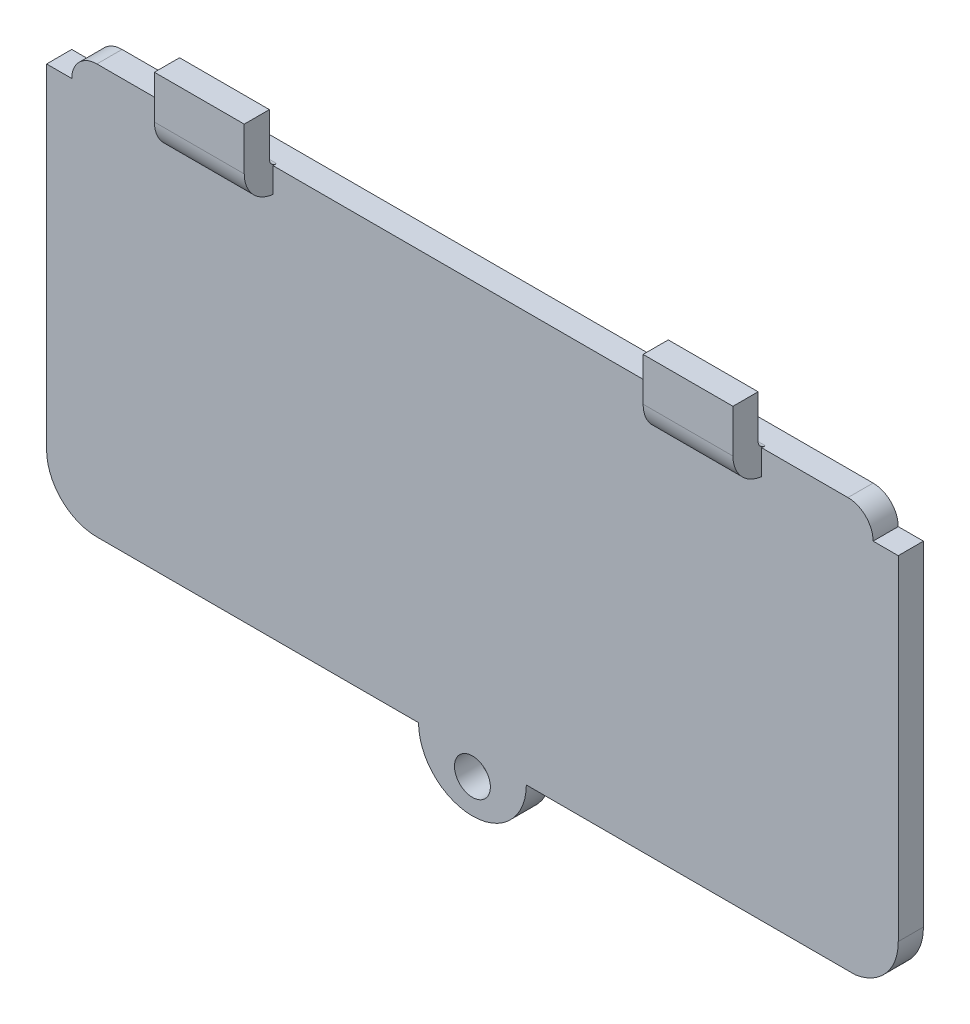
ISO-10303-21;
HEADER;
FILE_DESCRIPTION(('STEP AP214'),'2;1');
FILE_NAME('part.step','',(''),(''),'','','');
FILE_SCHEMA(('AUTOMOTIVE_DESIGN { 1 0 10303 214 1 1 1 1 }'));
ENDSEC;
DATA;
#1=APPLICATION_CONTEXT('core data for automotive mechanical design processes');
#2=APPLICATION_PROTOCOL_DEFINITION('international standard','automotive_design',2000,#1);
#3=PRODUCT_CONTEXT('',#1,'mechanical');
#4=PRODUCT('Part','Part','',(#3));
#5=PRODUCT_RELATED_PRODUCT_CATEGORY('part','',(#4));
#6=PRODUCT_DEFINITION_FORMATION('','',#4);
#7=PRODUCT_DEFINITION_CONTEXT('part definition',#1,'design');
#8=PRODUCT_DEFINITION('design','',#6,#7);
#9=PRODUCT_DEFINITION_SHAPE('','',#8);
#10=(LENGTH_UNIT() NAMED_UNIT(*) SI_UNIT(.MILLI.,.METRE.));
#11=(NAMED_UNIT(*) PLANE_ANGLE_UNIT() SI_UNIT($,.RADIAN.));
#12=(NAMED_UNIT(*) SI_UNIT($,.STERADIAN.) SOLID_ANGLE_UNIT());
#13=UNCERTAINTY_MEASURE_WITH_UNIT(LENGTH_MEASURE(1.E-05),#10,'distance_accuracy_value','');
#14=(GEOMETRIC_REPRESENTATION_CONTEXT(3) GLOBAL_UNCERTAINTY_ASSIGNED_CONTEXT((#13)) GLOBAL_UNIT_ASSIGNED_CONTEXT((#10,
#11,#12)) REPRESENTATION_CONTEXT('',''));
#15=CARTESIAN_POINT('',(0.,0.,0.));
#16=DIRECTION('',(0.,0.,1.));
#17=DIRECTION('',(1.,0.,0.));
#18=AXIS2_PLACEMENT_3D('',#15,#16,#17);
#19=CARTESIAN_POINT('',(20.193,14.351,1.524));
#20=DIRECTION('',(-1.,0.,0.));
#21=DIRECTION('',(0.,0.,1.));
#22=AXIS2_PLACEMENT_3D('',#19,#20,#21);
#23=CYLINDRICAL_SURFACE('',#22,2.286);
#24=DIRECTION('',(-1.,0.,0.));
#25=VECTOR('',#24,1.);
#26=CARTESIAN_POINT('',(20.193,12.0791549348602,1.778));
#27=LINE('',#26,#25);
#28=CARTESIAN_POINT('',(-14.351,12.0791549348602,1.778));
#29=VERTEX_POINT('',#28);
#30=CARTESIAN_POINT('',(-20.701,12.0791549348602,1.778));
#31=VERTEX_POINT('',#30);
#32=EDGE_CURVE('E391',#29,#31,#27,.T.);
#33=ORIENTED_EDGE('',*,*,#32,.F.);
#34=CARTESIAN_POINT('',(-14.351,14.351,1.524));
#35=DIRECTION('',(-1.,0.,0.));
#36=DIRECTION('',(0.,0.,1.));
#37=AXIS2_PLACEMENT_3D('',#34,#35,#36);
#38=CIRCLE('',#37,2.286);
#39=CARTESIAN_POINT('',(-14.351,14.351,3.81));
#40=VERTEX_POINT('',#39);
#41=EDGE_CURVE('E48',#40,#29,#38,.F.);
#42=ORIENTED_EDGE('',*,*,#41,.F.);
#43=DIRECTION('',(-1.,0.,0.));
#44=VECTOR('',#43,1.);
#45=CARTESIAN_POINT('',(20.193,14.351,3.81));
#46=LINE('',#45,#44);
#47=CARTESIAN_POINT('',(-20.701,14.351,3.81));
#48=VERTEX_POINT('',#47);
#49=EDGE_CURVE('E287',#40,#48,#46,.T.);
#50=ORIENTED_EDGE('',*,*,#49,.T.);
#51=CARTESIAN_POINT('',(-20.701,14.351,1.524));
#52=DIRECTION('',(-1.,0.,0.));
#53=DIRECTION('',(0.,0.,1.));
#54=AXIS2_PLACEMENT_3D('',#51,#52,#53);
#55=CIRCLE('',#54,2.286);
#56=EDGE_CURVE('E260',#31,#48,#55,.T.);
#57=ORIENTED_EDGE('',*,*,#56,.F.);
#58=EDGE_LOOP('',(#33,#42,#50,#57));
#59=FACE_BOUND('',#58,.T.);
#60=ADVANCED_FACE('F34',(#59),#23,.T.);
#61=CARTESIAN_POINT('',(20.193,14.351,1.524));
#62=DIRECTION('',(-1.,0.,0.));
#63=DIRECTION('',(0.,0.,1.));
#64=AXIS2_PLACEMENT_3D('',#61,#62,#63);
#65=CYLINDRICAL_SURFACE('',#64,0.508);
#66=CARTESIAN_POINT('',(-14.351,14.351,1.524));
#67=DIRECTION('',(-1.,0.,0.));
#68=DIRECTION('',(0.,0.,1.));
#69=AXIS2_PLACEMENT_3D('',#66,#67,#68);
#70=CIRCLE('',#69,0.508);
#71=CARTESIAN_POINT('',(-14.351,13.843,1.524));
#72=VERTEX_POINT('',#71);
#73=CARTESIAN_POINT('',(-14.351,14.351,2.032));
#74=VERTEX_POINT('',#73);
#75=EDGE_CURVE('E240',#72,#74,#70,.T.);
#76=ORIENTED_EDGE('',*,*,#75,.F.);
#77=DIRECTION('',(-1.,0.,0.));
#78=VECTOR('',#77,1.);
#79=CARTESIAN_POINT('',(20.193,13.843,1.524));
#80=LINE('',#79,#78);
#81=CARTESIAN_POINT('',(-20.701,13.843,1.524));
#82=VERTEX_POINT('',#81);
#83=EDGE_CURVE('E224',#72,#82,#80,.T.);
#84=ORIENTED_EDGE('',*,*,#83,.T.);
#85=CARTESIAN_POINT('',(-20.701,14.351,1.524));
#86=DIRECTION('',(1.,0.,0.));
#87=DIRECTION('',(0.,0.,1.));
#88=AXIS2_PLACEMENT_3D('',#85,#86,#87);
#89=CIRCLE('',#88,0.508);
#90=CARTESIAN_POINT('',(-20.701,14.351,2.032));
#91=VERTEX_POINT('',#90);
#92=EDGE_CURVE('E242',#91,#82,#89,.T.);
#93=ORIENTED_EDGE('',*,*,#92,.F.);
#94=DIRECTION('',(-1.,0.,0.));
#95=VECTOR('',#94,1.);
#96=CARTESIAN_POINT('',(20.193,14.351,2.032));
#97=LINE('',#96,#95);
#98=EDGE_CURVE('E275',#74,#91,#97,.T.);
#99=ORIENTED_EDGE('',*,*,#98,.F.);
#100=EDGE_LOOP('',(#76,#84,#93,#99));
#101=FACE_BOUND('',#100,.T.);
#102=ADVANCED_FACE('F436',(#101),#65,.F.);
#103=CARTESIAN_POINT('',(20.193,14.351,2.032));
#104=DIRECTION('',(0.,0.,-1.));
#105=DIRECTION('',(-1.,0.,0.));
#106=AXIS2_PLACEMENT_3D('',#103,#104,#105);
#107=PLANE('',#106);
#108=DIRECTION('',(0.,1.,0.));
#109=VECTOR('',#108,1.);
#110=CARTESIAN_POINT('',(-14.351,14.351,2.032));
#111=LINE('',#110,#109);
#112=CARTESIAN_POINT('',(-14.351,17.399,2.032));
#113=VERTEX_POINT('',#112);
#114=EDGE_CURVE('E238',#74,#113,#111,.T.);
#115=ORIENTED_EDGE('',*,*,#114,.F.);
#116=ORIENTED_EDGE('',*,*,#98,.T.);
#117=DIRECTION('',(0.,-1.,0.));
#118=VECTOR('',#117,1.);
#119=CARTESIAN_POINT('',(-20.701,14.351,2.032));
#120=LINE('',#119,#118);
#121=CARTESIAN_POINT('',(-20.701,17.399,2.032));
#122=VERTEX_POINT('',#121);
#123=EDGE_CURVE('E247',#122,#91,#120,.T.);
#124=ORIENTED_EDGE('',*,*,#123,.F.);
#125=DIRECTION('',(-1.,0.,0.));
#126=VECTOR('',#125,1.);
#127=CARTESIAN_POINT('',(20.193,17.399,2.032));
#128=LINE('',#127,#126);
#129=EDGE_CURVE('E279',#113,#122,#128,.T.);
#130=ORIENTED_EDGE('',*,*,#129,.F.);
#131=EDGE_LOOP('',(#115,#116,#124,#130));
#132=FACE_BOUND('',#131,.T.);
#133=ADVANCED_FACE('F441',(#132),#107,.T.);
#134=CARTESIAN_POINT('',(20.193,17.399,2.032));
#135=DIRECTION('',(0.,1.,0.));
#136=DIRECTION('',(0.,0.,1.));
#137=AXIS2_PLACEMENT_3D('',#134,#135,#136);
#138=PLANE('',#137);
#139=DIRECTION('',(0.,0.,1.));
#140=VECTOR('',#139,1.);
#141=CARTESIAN_POINT('',(-14.351,17.399,-1.397));
#142=LINE('',#141,#140);
#143=CARTESIAN_POINT('',(-14.351,17.399,3.81));
#144=VERTEX_POINT('',#143);
#145=EDGE_CURVE('E233',#113,#144,#142,.T.);
#146=ORIENTED_EDGE('',*,*,#145,.F.);
#147=ORIENTED_EDGE('',*,*,#129,.T.);
#148=DIRECTION('',(0.,0.,-1.));
#149=VECTOR('',#148,1.);
#150=CARTESIAN_POINT('',(-20.701,17.399,2.032));
#151=LINE('',#150,#149);
#152=CARTESIAN_POINT('',(-20.701,17.399,3.81));
#153=VERTEX_POINT('',#152);
#154=EDGE_CURVE('E266',#153,#122,#151,.T.);
#155=ORIENTED_EDGE('',*,*,#154,.F.);
#156=DIRECTION('',(-1.,0.,0.));
#157=VECTOR('',#156,1.);
#158=CARTESIAN_POINT('',(20.193,17.399,3.81));
#159=LINE('',#158,#157);
#160=EDGE_CURVE('E283',#144,#153,#159,.T.);
#161=ORIENTED_EDGE('',*,*,#160,.F.);
#162=EDGE_LOOP('',(#146,#147,#155,#161));
#163=FACE_BOUND('',#162,.T.);
#164=ADVANCED_FACE('F540',(#163),#138,.T.);
#165=CARTESIAN_POINT('',(20.193,14.351,3.81));
#166=DIRECTION('',(0.,0.,1.));
#167=DIRECTION('',(1.,0.,0.));
#168=AXIS2_PLACEMENT_3D('',#165,#166,#167);
#169=PLANE('',#168);
#170=DIRECTION('',(0.,-1.,0.));
#171=VECTOR('',#170,1.);
#172=CARTESIAN_POINT('',(-14.351,14.351,3.81));
#173=LINE('',#172,#171);
#174=EDGE_CURVE('E11',#144,#40,#173,.T.);
#175=ORIENTED_EDGE('',*,*,#174,.F.);
#176=ORIENTED_EDGE('',*,*,#160,.T.);
#177=DIRECTION('',(0.,1.,0.));
#178=VECTOR('',#177,1.);
#179=CARTESIAN_POINT('',(-20.701,14.351,3.81));
#180=LINE('',#179,#178);
#181=EDGE_CURVE('E263',#48,#153,#180,.T.);
#182=ORIENTED_EDGE('',*,*,#181,.F.);
#183=ORIENTED_EDGE('',*,*,#49,.F.);
#184=EDGE_LOOP('',(#175,#176,#182,#183));
#185=FACE_BOUND('',#184,.T.);
#186=ADVANCED_FACE('F534',(#185),#169,.T.);
#187=CARTESIAN_POINT('',(-26.797,13.843,1.778));
#188=DIRECTION('',(0.,-1.,0.));
#189=DIRECTION('',(0.,0.,-1.));
#190=AXIS2_PLACEMENT_3D('',#187,#188,#189);
#191=PLANE('',#190);
#192=DIRECTION('',(0.,0.,1.));
#193=VECTOR('',#192,1.);
#194=CARTESIAN_POINT('',(-14.351,13.843,-1.397));
#195=LINE('',#194,#193);
#196=CARTESIAN_POINT('',(-14.351,13.843,1.778));
#197=VERTEX_POINT('',#196);
#198=EDGE_CURVE('E216',#72,#197,#195,.T.);
#199=ORIENTED_EDGE('',*,*,#198,.T.);
#200=DIRECTION('',(1.,0.,0.));
#201=VECTOR('',#200,1.);
#202=CARTESIAN_POINT('',(-26.797,13.843,1.778));
#203=LINE('',#202,#201);
#204=CARTESIAN_POINT('',(13.843,13.843,1.778));
#205=VERTEX_POINT('',#204);
#206=EDGE_CURVE('E206',#197,#205,#203,.T.);
#207=ORIENTED_EDGE('',*,*,#206,.T.);
#208=DIRECTION('',(0.,0.,1.));
#209=VECTOR('',#208,1.);
#210=CARTESIAN_POINT('',(13.843,13.843,-1.397));
#211=LINE('',#210,#209);
#212=CARTESIAN_POINT('',(13.843,13.843,1.524));
#213=VERTEX_POINT('',#212);
#214=EDGE_CURVE('E225',#213,#205,#211,.T.);
#215=ORIENTED_EDGE('',*,*,#214,.F.);
#216=CARTESIAN_POINT('',(20.193,13.843,1.524));
#217=VERTEX_POINT('',#216);
#218=EDGE_CURVE('E288',#217,#213,#80,.T.);
#219=ORIENTED_EDGE('',*,*,#218,.F.);
#220=DIRECTION('',(0.,0.,-1.));
#221=VECTOR('',#220,1.);
#222=CARTESIAN_POINT('',(20.193,13.843,1.778));
#223=LINE('',#222,#221);
#224=CARTESIAN_POINT('',(20.193,13.843,1.778));
#225=VERTEX_POINT('',#224);
#226=EDGE_CURVE('E292',#225,#217,#223,.T.);
#227=ORIENTED_EDGE('',*,*,#226,.F.);
#228=DIRECTION('',(-1.,0.,0.));
#229=VECTOR('',#228,1.);
#230=CARTESIAN_POINT('',(-26.797,13.843,1.778));
#231=LINE('',#230,#229);
#232=CARTESIAN_POINT('',(26.289,13.843,1.778));
#233=VERTEX_POINT('',#232);
#234=EDGE_CURVE('E306',#233,#225,#231,.T.);
#235=ORIENTED_EDGE('',*,*,#234,.F.);
#236=DIRECTION('',(0.,0.,-1.));
#237=VECTOR('',#236,1.);
#238=CARTESIAN_POINT('',(26.289,13.843,1.778));
#239=LINE('',#238,#237);
#240=CARTESIAN_POINT('',(26.289,13.843,0.));
#241=VERTEX_POINT('',#240);
#242=EDGE_CURVE('E385',#233,#241,#239,.T.);
#243=ORIENTED_EDGE('',*,*,#242,.T.);
#244=DIRECTION('',(-1.,0.,0.));
#245=VECTOR('',#244,1.);
#246=CARTESIAN_POINT('',(-26.797,13.843,0.));
#247=LINE('',#246,#245);
#248=CARTESIAN_POINT('',(-26.797,13.843,0.));
#249=VERTEX_POINT('',#248);
#250=EDGE_CURVE('E332',#241,#249,#247,.T.);
#251=ORIENTED_EDGE('',*,*,#250,.T.);
#252=DIRECTION('',(0.,0.,-1.));
#253=VECTOR('',#252,1.);
#254=CARTESIAN_POINT('',(-26.797,13.843,1.778));
#255=LINE('',#254,#253);
#256=CARTESIAN_POINT('',(-26.797,13.843,1.778));
#257=VERTEX_POINT('',#256);
#258=EDGE_CURVE('E382',#257,#249,#255,.T.);
#259=ORIENTED_EDGE('',*,*,#258,.F.);
#260=CARTESIAN_POINT('',(-20.701,13.843,1.778));
#261=VERTEX_POINT('',#260);
#262=EDGE_CURVE('E304',#261,#257,#231,.T.);
#263=ORIENTED_EDGE('',*,*,#262,.F.);
#264=DIRECTION('',(0.,0.,-1.));
#265=VECTOR('',#264,1.);
#266=CARTESIAN_POINT('',(-20.701,13.843,1.778));
#267=LINE('',#266,#265);
#268=EDGE_CURVE('E274',#261,#82,#267,.T.);
#269=ORIENTED_EDGE('',*,*,#268,.T.);
#270=ORIENTED_EDGE('',*,*,#83,.F.);
#271=EDGE_LOOP('',(#199,#207,#215,#219,#227,#235,#243,#251,#259,#263,#269,#270));
#272=FACE_BOUND('',#271,.T.);
#273=ADVANCED_FACE('F222',(#272),#191,.F.);
#274=CARTESIAN_POINT('',(26.289,12.065,1.778));
#275=DIRECTION('',(0.,0.,-1.));
#276=DIRECTION('',(-1.,0.,0.));
#277=AXIS2_PLACEMENT_3D('',#274,#275,#276);
#278=PLANE('',#277);
#279=CARTESIAN_POINT('',(-0.253999999999994,-16.51,1.778));
#280=DIRECTION('',(0.,0.,-1.));
#281=DIRECTION('',(-1.,0.,0.));
#282=AXIS2_PLACEMENT_3D('',#279,#280,#281);
#283=CIRCLE('',#282,1.27);
#284=CARTESIAN_POINT('',(-1.524,-16.51,1.778));
#285=VERTEX_POINT('',#284);
#286=EDGE_CURVE('E295',#285,#285,#283,.T.);
#287=ORIENTED_EDGE('',*,*,#286,.T.);
#288=EDGE_LOOP('',(#287));
#289=FACE_BOUND('',#288,.T.);
#290=CARTESIAN_POINT('',(-0.254000000000006,-15.113,1.778));
#291=DIRECTION('',(0.,0.,1.));
#292=DIRECTION('',(1.,0.,0.));
#293=AXIS2_PLACEMENT_3D('',#290,#291,#292);
#294=CIRCLE('',#293,3.81);
#295=CARTESIAN_POINT('',(-4.06400000000001,-15.113,1.778));
#296=VERTEX_POINT('',#295);
#297=CARTESIAN_POINT('',(3.55599999999999,-15.113,1.778));
#298=VERTEX_POINT('',#297);
#299=EDGE_CURVE('E319',#296,#298,#294,.T.);
#300=ORIENTED_EDGE('',*,*,#299,.T.);
#301=DIRECTION('',(1.,0.,0.));
#302=VECTOR('',#301,1.);
#303=CARTESIAN_POINT('',(3.55599999999999,-15.113,1.778));
#304=LINE('',#303,#302);
#305=CARTESIAN_POINT('',(26.797,-15.113,1.778));
#306=VERTEX_POINT('',#305);
#307=EDGE_CURVE('E321',#298,#306,#304,.T.);
#308=ORIENTED_EDGE('',*,*,#307,.T.);
#309=CARTESIAN_POINT('',(26.2891867732896,-11.5934458056768,1.778));
#310=DIRECTION('',(0.,0.,1.));
#311=DIRECTION('',(1.,0.,0.));
#312=AXIS2_PLACEMENT_3D('',#309,#310,#311);
#313=CIRCLE('',#312,3.556);
#314=CARTESIAN_POINT('',(29.845,-11.557,1.778));
#315=VERTEX_POINT('',#314);
#316=EDGE_CURVE('E323',#306,#315,#313,.T.);
#317=ORIENTED_EDGE('',*,*,#316,.T.);
#318=DIRECTION('',(0.,1.,0.));
#319=VECTOR('',#318,1.);
#320=CARTESIAN_POINT('',(29.845,12.065,1.778));
#321=LINE('',#320,#319);
#322=CARTESIAN_POINT('',(29.845,12.065,1.778));
#323=VERTEX_POINT('',#322);
#324=EDGE_CURVE('E325',#315,#323,#321,.T.);
#325=ORIENTED_EDGE('',*,*,#324,.T.);
#326=DIRECTION('',(-1.,0.,0.));
#327=VECTOR('',#326,1.);
#328=CARTESIAN_POINT('',(28.067,12.065,1.778));
#329=LINE('',#328,#327);
#330=CARTESIAN_POINT('',(28.067,12.065,1.778));
#331=VERTEX_POINT('',#330);
#332=EDGE_CURVE('E327',#323,#331,#329,.T.);
#333=ORIENTED_EDGE('',*,*,#332,.T.);
#334=CARTESIAN_POINT('',(26.289,12.065,1.778));
#335=DIRECTION('',(0.,0.,1.));
#336=DIRECTION('',(-1.,0.,0.));
#337=AXIS2_PLACEMENT_3D('',#334,#335,#336);
#338=CIRCLE('',#337,1.778);
#339=EDGE_CURVE('E301',#331,#233,#338,.T.);
#340=ORIENTED_EDGE('',*,*,#339,.T.);
#341=ORIENTED_EDGE('',*,*,#234,.T.);
#342=DIRECTION('',(0.,1.,0.));
#343=VECTOR('',#342,1.);
#344=CARTESIAN_POINT('',(20.193,12.065,1.778));
#345=LINE('',#344,#343);
#346=CARTESIAN_POINT('',(20.193,12.0791549348602,1.778));
#347=VERTEX_POINT('',#346);
#348=EDGE_CURVE('E394',#347,#225,#345,.T.);
#349=ORIENTED_EDGE('',*,*,#348,.F.);
#350=CARTESIAN_POINT('',(13.843,12.0791549348602,1.778));
#351=VERTEX_POINT('',#350);
#352=EDGE_CURVE('E392',#347,#351,#27,.T.);
#353=ORIENTED_EDGE('',*,*,#352,.T.);
#354=DIRECTION('',(0.,-1.,0.));
#355=VECTOR('',#354,1.);
#356=CARTESIAN_POINT('',(13.843,16.637,1.778));
#357=LINE('',#356,#355);
#358=EDGE_CURVE('E211',#205,#351,#357,.T.);
#359=ORIENTED_EDGE('',*,*,#358,.F.);
#360=ORIENTED_EDGE('',*,*,#206,.F.);
#361=DIRECTION('',(0.,-1.,0.));
#362=VECTOR('',#361,1.);
#363=CARTESIAN_POINT('',(-14.351,16.637,1.778));
#364=LINE('',#363,#362);
#365=EDGE_CURVE('E208',#197,#29,#364,.T.);
#366=ORIENTED_EDGE('',*,*,#365,.T.);
#367=ORIENTED_EDGE('',*,*,#32,.T.);
#368=DIRECTION('',(0.,1.,0.));
#369=VECTOR('',#368,1.);
#370=CARTESIAN_POINT('',(-20.701,12.065,1.778));
#371=LINE('',#370,#369);
#372=EDGE_CURVE('E388',#31,#261,#371,.T.);
#373=ORIENTED_EDGE('',*,*,#372,.T.);
#374=ORIENTED_EDGE('',*,*,#262,.T.);
#375=CARTESIAN_POINT('',(-26.797,12.065,1.778));
#376=DIRECTION('',(0.,0.,1.));
#377=DIRECTION('',(1.,0.,0.));
#378=AXIS2_PLACEMENT_3D('',#375,#376,#377);
#379=CIRCLE('',#378,1.778);
#380=CARTESIAN_POINT('',(-28.575,12.065,1.778));
#381=VERTEX_POINT('',#380);
#382=EDGE_CURVE('E309',#257,#381,#379,.T.);
#383=ORIENTED_EDGE('',*,*,#382,.T.);
#384=DIRECTION('',(-1.,0.,0.));
#385=VECTOR('',#384,1.);
#386=CARTESIAN_POINT('',(-30.353,12.065,1.778));
#387=LINE('',#386,#385);
#388=CARTESIAN_POINT('',(-30.353,12.065,1.778));
#389=VERTEX_POINT('',#388);
#390=EDGE_CURVE('E311',#381,#389,#387,.T.);
#391=ORIENTED_EDGE('',*,*,#390,.T.);
#392=DIRECTION('',(0.,-1.,0.));
#393=VECTOR('',#392,1.);
#394=CARTESIAN_POINT('',(-30.353,12.065,1.778));
#395=LINE('',#394,#393);
#396=CARTESIAN_POINT('',(-30.353,-11.557,1.778));
#397=VERTEX_POINT('',#396);
#398=EDGE_CURVE('E313',#389,#397,#395,.T.);
#399=ORIENTED_EDGE('',*,*,#398,.T.);
#400=CARTESIAN_POINT('',(-26.797,-11.557,1.778));
#401=DIRECTION('',(0.,0.,1.));
#402=DIRECTION('',(1.,0.,0.));
#403=AXIS2_PLACEMENT_3D('',#400,#401,#402);
#404=CIRCLE('',#403,3.556);
#405=CARTESIAN_POINT('',(-26.797,-15.113,1.778));
#406=VERTEX_POINT('',#405);
#407=EDGE_CURVE('E315',#397,#406,#404,.T.);
#408=ORIENTED_EDGE('',*,*,#407,.T.);
#409=DIRECTION('',(1.,0.,0.));
#410=VECTOR('',#409,1.);
#411=CARTESIAN_POINT('',(-26.797,-15.113,1.778));
#412=LINE('',#411,#410);
#413=EDGE_CURVE('E317',#406,#296,#412,.T.);
#414=ORIENTED_EDGE('',*,*,#413,.T.);
#415=EDGE_LOOP('',(#300,#308,#317,#325,#333,#340,#341,#349,#353,#359,#360,#366,#367,#373,#374,
#383,#391,#399,#408,#414));
#416=FACE_BOUND('',#415,.T.);
#417=ADVANCED_FACE('F207',(#289,#416),#278,.F.);
#418=CARTESIAN_POINT('',(26.289,12.065,1.778));
#419=DIRECTION('',(0.,0.,-1.));
#420=DIRECTION('',(-1.,0.,0.));
#421=AXIS2_PLACEMENT_3D('',#418,#419,#420);
#422=CYLINDRICAL_SURFACE('',#421,1.778);
#423=CARTESIAN_POINT('',(26.289,12.065,0.));
#424=DIRECTION('',(0.,0.,1.));
#425=DIRECTION('',(-1.,0.,0.));
#426=AXIS2_PLACEMENT_3D('',#423,#424,#425);
#427=CIRCLE('',#426,1.778);
#428=CARTESIAN_POINT('',(28.067,12.065,0.));
#429=VERTEX_POINT('',#428);
#430=EDGE_CURVE('E298',#429,#241,#427,.T.);
#431=ORIENTED_EDGE('',*,*,#430,.T.);
#432=ORIENTED_EDGE('',*,*,#242,.F.);
#433=ORIENTED_EDGE('',*,*,#339,.F.);
#434=DIRECTION('',(0.,0.,-1.));
#435=VECTOR('',#434,1.);
#436=CARTESIAN_POINT('',(28.067,12.065,1.778));
#437=LINE('',#436,#435);
#438=EDGE_CURVE('E329',#331,#429,#437,.T.);
#439=ORIENTED_EDGE('',*,*,#438,.T.);
#440=EDGE_LOOP('',(#431,#432,#433,#439));
#441=FACE_BOUND('',#440,.T.);
#442=ADVANCED_FACE('F36',(#441),#422,.T.);
#443=CARTESIAN_POINT('',(-26.797,12.065,1.778));
#444=DIRECTION('',(0.,0.,-1.));
#445=DIRECTION('',(-1.,0.,0.));
#446=AXIS2_PLACEMENT_3D('',#443,#444,#445);
#447=CYLINDRICAL_SURFACE('',#446,1.778);
#448=CARTESIAN_POINT('',(-26.797,12.065,0.));
#449=DIRECTION('',(0.,0.,1.));
#450=DIRECTION('',(1.,0.,0.));
#451=AXIS2_PLACEMENT_3D('',#448,#449,#450);
#452=CIRCLE('',#451,1.778);
#453=CARTESIAN_POINT('',(-28.575,12.065,0.));
#454=VERTEX_POINT('',#453);
#455=EDGE_CURVE('E334',#249,#454,#452,.T.);
#456=ORIENTED_EDGE('',*,*,#455,.T.);
#457=DIRECTION('',(0.,0.,-1.));
#458=VECTOR('',#457,1.);
#459=CARTESIAN_POINT('',(-28.575,12.065,1.778));
#460=LINE('',#459,#458);
#461=EDGE_CURVE('E379',#381,#454,#460,.T.);
#462=ORIENTED_EDGE('',*,*,#461,.F.);
#463=ORIENTED_EDGE('',*,*,#382,.F.);
#464=ORIENTED_EDGE('',*,*,#258,.T.);
#465=EDGE_LOOP('',(#456,#462,#463,#464));
#466=FACE_BOUND('',#465,.T.);
#467=ADVANCED_FACE('F456',(#466),#447,.T.);
#468=CARTESIAN_POINT('',(-30.353,12.065,1.778));
#469=DIRECTION('',(0.,-1.,0.));
#470=DIRECTION('',(0.,0.,-1.));
#471=AXIS2_PLACEMENT_3D('',#468,#469,#470);
#472=PLANE('',#471);
#473=DIRECTION('',(-1.,0.,0.));
#474=VECTOR('',#473,1.);
#475=CARTESIAN_POINT('',(-30.353,12.065,0.));
#476=LINE('',#475,#474);
#477=CARTESIAN_POINT('',(-30.353,12.065,0.));
#478=VERTEX_POINT('',#477);
#479=EDGE_CURVE('E336',#454,#478,#476,.T.);
#480=ORIENTED_EDGE('',*,*,#479,.T.);
#481=DIRECTION('',(0.,0.,-1.));
#482=VECTOR('',#481,1.);
#483=CARTESIAN_POINT('',(-30.353,12.065,1.778));
#484=LINE('',#483,#482);
#485=EDGE_CURVE('E376',#389,#478,#484,.T.);
#486=ORIENTED_EDGE('',*,*,#485,.F.);
#487=ORIENTED_EDGE('',*,*,#390,.F.);
#488=ORIENTED_EDGE('',*,*,#461,.T.);
#489=EDGE_LOOP('',(#480,#486,#487,#488));
#490=FACE_BOUND('',#489,.T.);
#491=ADVANCED_FACE('F460',(#490),#472,.F.);
#492=CARTESIAN_POINT('',(-30.353,12.065,1.778));
#493=DIRECTION('',(1.,0.,0.));
#494=DIRECTION('',(0.,0.,-1.));
#495=AXIS2_PLACEMENT_3D('',#492,#493,#494);
#496=PLANE('',#495);
#497=DIRECTION('',(0.,-1.,0.));
#498=VECTOR('',#497,1.);
#499=CARTESIAN_POINT('',(-30.353,12.065,0.));
#500=LINE('',#499,#498);
#501=CARTESIAN_POINT('',(-30.353,-11.557,0.));
#502=VERTEX_POINT('',#501);
#503=EDGE_CURVE('E338',#478,#502,#500,.T.);
#504=ORIENTED_EDGE('',*,*,#503,.T.);
#505=DIRECTION('',(0.,0.,-1.));
#506=VECTOR('',#505,1.);
#507=CARTESIAN_POINT('',(-30.353,-11.557,1.778));
#508=LINE('',#507,#506);
#509=EDGE_CURVE('E373',#397,#502,#508,.T.);
#510=ORIENTED_EDGE('',*,*,#509,.F.);
#511=ORIENTED_EDGE('',*,*,#398,.F.);
#512=ORIENTED_EDGE('',*,*,#485,.T.);
#513=EDGE_LOOP('',(#504,#510,#511,#512));
#514=FACE_BOUND('',#513,.T.);
#515=ADVANCED_FACE('F465',(#514),#496,.F.);
#516=CARTESIAN_POINT('',(-26.797,-11.557,1.778));
#517=DIRECTION('',(0.,0.,-1.));
#518=DIRECTION('',(-1.,0.,0.));
#519=AXIS2_PLACEMENT_3D('',#516,#517,#518);
#520=CYLINDRICAL_SURFACE('',#519,3.556);
#521=CARTESIAN_POINT('',(-26.797,-11.557,0.));
#522=DIRECTION('',(0.,0.,1.));
#523=DIRECTION('',(1.,0.,0.));
#524=AXIS2_PLACEMENT_3D('',#521,#522,#523);
#525=CIRCLE('',#524,3.556);
#526=CARTESIAN_POINT('',(-26.797,-15.113,0.));
#527=VERTEX_POINT('',#526);
#528=EDGE_CURVE('E340',#502,#527,#525,.T.);
#529=ORIENTED_EDGE('',*,*,#528,.T.);
#530=DIRECTION('',(0.,0.,-1.));
#531=VECTOR('',#530,1.);
#532=CARTESIAN_POINT('',(-26.797,-15.113,1.778));
#533=LINE('',#532,#531);
#534=EDGE_CURVE('E370',#406,#527,#533,.T.);
#535=ORIENTED_EDGE('',*,*,#534,.F.);
#536=ORIENTED_EDGE('',*,*,#407,.F.);
#537=ORIENTED_EDGE('',*,*,#509,.T.);
#538=EDGE_LOOP('',(#529,#535,#536,#537));
#539=FACE_BOUND('',#538,.T.);
#540=ADVANCED_FACE('F471',(#539),#520,.T.);
#541=CARTESIAN_POINT('',(-26.797,-15.113,1.778));
#542=DIRECTION('',(0.,1.,0.));
#543=DIRECTION('',(0.,0.,1.));
#544=AXIS2_PLACEMENT_3D('',#541,#542,#543);
#545=PLANE('',#544);
#546=DIRECTION('',(1.,0.,0.));
#547=VECTOR('',#546,1.);
#548=CARTESIAN_POINT('',(-26.797,-15.113,0.));
#549=LINE('',#548,#547);
#550=CARTESIAN_POINT('',(-4.06400000000001,-15.113,0.));
#551=VERTEX_POINT('',#550);
#552=EDGE_CURVE('E342',#527,#551,#549,.T.);
#553=ORIENTED_EDGE('',*,*,#552,.T.);
#554=DIRECTION('',(0.,0.,-1.));
#555=VECTOR('',#554,1.);
#556=CARTESIAN_POINT('',(-4.06400000000001,-15.113,1.778));
#557=LINE('',#556,#555);
#558=EDGE_CURVE('E367',#296,#551,#557,.T.);
#559=ORIENTED_EDGE('',*,*,#558,.F.);
#560=ORIENTED_EDGE('',*,*,#413,.F.);
#561=ORIENTED_EDGE('',*,*,#534,.T.);
#562=EDGE_LOOP('',(#553,#559,#560,#561));
#563=FACE_BOUND('',#562,.T.);
#564=ADVANCED_FACE('F475',(#563),#545,.F.);
#565=CARTESIAN_POINT('',(-0.254000000000006,-15.113,1.778));
#566=DIRECTION('',(0.,0.,-1.));
#567=DIRECTION('',(-1.,0.,0.));
#568=AXIS2_PLACEMENT_3D('',#565,#566,#567);
#569=CYLINDRICAL_SURFACE('',#568,3.81);
#570=CARTESIAN_POINT('',(-0.254000000000006,-15.113,0.));
#571=DIRECTION('',(0.,0.,1.));
#572=DIRECTION('',(1.,0.,0.));
#573=AXIS2_PLACEMENT_3D('',#570,#571,#572);
#574=CIRCLE('',#573,3.81);
#575=CARTESIAN_POINT('',(3.55599999999999,-15.113,0.));
#576=VERTEX_POINT('',#575);
#577=EDGE_CURVE('E344',#551,#576,#574,.T.);
#578=ORIENTED_EDGE('',*,*,#577,.T.);
#579=DIRECTION('',(0.,0.,-1.));
#580=VECTOR('',#579,1.);
#581=CARTESIAN_POINT('',(3.55599999999999,-15.113,1.778));
#582=LINE('',#581,#580);
#583=EDGE_CURVE('E364',#298,#576,#582,.T.);
#584=ORIENTED_EDGE('',*,*,#583,.F.);
#585=ORIENTED_EDGE('',*,*,#299,.F.);
#586=ORIENTED_EDGE('',*,*,#558,.T.);
#587=EDGE_LOOP('',(#578,#584,#585,#586));
#588=FACE_BOUND('',#587,.T.);
#589=ADVANCED_FACE('F480',(#588),#569,.T.);
#590=CARTESIAN_POINT('',(3.55599999999999,-15.113,1.778));
#591=DIRECTION('',(0.,1.,0.));
#592=DIRECTION('',(0.,0.,1.));
#593=AXIS2_PLACEMENT_3D('',#590,#591,#592);
#594=PLANE('',#593);
#595=DIRECTION('',(1.,0.,0.));
#596=VECTOR('',#595,1.);
#597=CARTESIAN_POINT('',(3.55599999999999,-15.113,0.));
#598=LINE('',#597,#596);
#599=CARTESIAN_POINT('',(26.797,-15.113,0.));
#600=VERTEX_POINT('',#599);
#601=EDGE_CURVE('E346',#576,#600,#598,.T.);
#602=ORIENTED_EDGE('',*,*,#601,.T.);
#603=DIRECTION('',(0.,0.,-1.));
#604=VECTOR('',#603,1.);
#605=CARTESIAN_POINT('',(26.797,-15.113,1.778));
#606=LINE('',#605,#604);
#607=EDGE_CURVE('E361',#306,#600,#606,.T.);
#608=ORIENTED_EDGE('',*,*,#607,.F.);
#609=ORIENTED_EDGE('',*,*,#307,.F.);
#610=ORIENTED_EDGE('',*,*,#583,.T.);
#611=EDGE_LOOP('',(#602,#608,#609,#610));
#612=FACE_BOUND('',#611,.T.);
#613=ADVANCED_FACE('F486',(#612),#594,.F.);
#614=CARTESIAN_POINT('',(26.2891867732896,-11.5934458056768,1.778));
#615=DIRECTION('',(0.,0.,-1.));
#616=DIRECTION('',(-1.,0.,0.));
#617=AXIS2_PLACEMENT_3D('',#614,#615,#616);
#618=CYLINDRICAL_SURFACE('',#617,3.556);
#619=CARTESIAN_POINT('',(26.2891867732896,-11.5934458056768,0.));
#620=DIRECTION('',(0.,0.,1.));
#621=DIRECTION('',(1.,0.,0.));
#622=AXIS2_PLACEMENT_3D('',#619,#620,#621);
#623=CIRCLE('',#622,3.556);
#624=CARTESIAN_POINT('',(29.845,-11.557,0.));
#625=VERTEX_POINT('',#624);
#626=EDGE_CURVE('E348',#600,#625,#623,.T.);
#627=ORIENTED_EDGE('',*,*,#626,.T.);
#628=DIRECTION('',(0.,0.,-1.));
#629=VECTOR('',#628,1.);
#630=CARTESIAN_POINT('',(29.845,-11.557,1.778));
#631=LINE('',#630,#629);
#632=EDGE_CURVE('E358',#315,#625,#631,.T.);
#633=ORIENTED_EDGE('',*,*,#632,.F.);
#634=ORIENTED_EDGE('',*,*,#316,.F.);
#635=ORIENTED_EDGE('',*,*,#607,.T.);
#636=EDGE_LOOP('',(#627,#633,#634,#635));
#637=FACE_BOUND('',#636,.T.);
#638=ADVANCED_FACE('F490',(#637),#618,.T.);
#639=CARTESIAN_POINT('',(29.845,12.065,1.778));
#640=DIRECTION('',(-1.,0.,0.));
#641=DIRECTION('',(0.,0.,1.));
#642=AXIS2_PLACEMENT_3D('',#639,#640,#641);
#643=PLANE('',#642);
#644=DIRECTION('',(0.,1.,0.));
#645=VECTOR('',#644,1.);
#646=CARTESIAN_POINT('',(29.845,12.065,0.));
#647=LINE('',#646,#645);
#648=CARTESIAN_POINT('',(29.845,12.065,0.));
#649=VERTEX_POINT('',#648);
#650=EDGE_CURVE('E350',#625,#649,#647,.T.);
#651=ORIENTED_EDGE('',*,*,#650,.T.);
#652=DIRECTION('',(0.,0.,-1.));
#653=VECTOR('',#652,1.);
#654=CARTESIAN_POINT('',(29.845,12.065,1.778));
#655=LINE('',#654,#653);
#656=EDGE_CURVE('E355',#323,#649,#655,.T.);
#657=ORIENTED_EDGE('',*,*,#656,.F.);
#658=ORIENTED_EDGE('',*,*,#324,.F.);
#659=ORIENTED_EDGE('',*,*,#632,.T.);
#660=EDGE_LOOP('',(#651,#657,#658,#659));
#661=FACE_BOUND('',#660,.T.);
#662=ADVANCED_FACE('F495',(#661),#643,.F.);
#663=CARTESIAN_POINT('',(28.067,12.065,1.778));
#664=DIRECTION('',(0.,-1.,0.));
#665=DIRECTION('',(1.,0.,0.));
#666=AXIS2_PLACEMENT_3D('',#663,#664,#665);
#667=PLANE('',#666);
#668=DIRECTION('',(-1.,0.,0.));
#669=VECTOR('',#668,1.);
#670=CARTESIAN_POINT('',(28.067,12.065,0.));
#671=LINE('',#670,#669);
#672=EDGE_CURVE('E305',#649,#429,#671,.T.);
#673=ORIENTED_EDGE('',*,*,#672,.T.);
#674=ORIENTED_EDGE('',*,*,#438,.F.);
#675=ORIENTED_EDGE('',*,*,#332,.F.);
#676=ORIENTED_EDGE('',*,*,#656,.T.);
#677=EDGE_LOOP('',(#673,#674,#675,#676));
#678=FACE_BOUND('',#677,.T.);
#679=ADVANCED_FACE('F501',(#678),#667,.F.);
#680=CARTESIAN_POINT('',(26.289,12.065,0.));
#681=DIRECTION('',(0.,0.,-1.));
#682=DIRECTION('',(-1.,0.,0.));
#683=AXIS2_PLACEMENT_3D('',#680,#681,#682);
#684=PLANE('',#683);
#685=CARTESIAN_POINT('',(-0.253999999999994,-16.51,0.));
#686=DIRECTION('',(0.,0.,-1.));
#687=DIRECTION('',(-1.,0.,0.));
#688=AXIS2_PLACEMENT_3D('',#685,#686,#687);
#689=CIRCLE('',#688,1.27);
#690=CARTESIAN_POINT('',(-1.524,-16.51,0.));
#691=VERTEX_POINT('',#690);
#692=EDGE_CURVE('E294',#691,#691,#689,.T.);
#693=ORIENTED_EDGE('',*,*,#692,.F.);
#694=EDGE_LOOP('',(#693));
#695=FACE_BOUND('',#694,.T.);
#696=ORIENTED_EDGE('',*,*,#430,.F.);
#697=ORIENTED_EDGE('',*,*,#672,.F.);
#698=ORIENTED_EDGE('',*,*,#650,.F.);
#699=ORIENTED_EDGE('',*,*,#626,.F.);
#700=ORIENTED_EDGE('',*,*,#601,.F.);
#701=ORIENTED_EDGE('',*,*,#577,.F.);
#702=ORIENTED_EDGE('',*,*,#552,.F.);
#703=ORIENTED_EDGE('',*,*,#528,.F.);
#704=ORIENTED_EDGE('',*,*,#503,.F.);
#705=ORIENTED_EDGE('',*,*,#479,.F.);
#706=ORIENTED_EDGE('',*,*,#455,.F.);
#707=ORIENTED_EDGE('',*,*,#250,.F.);
#708=EDGE_LOOP('',(#696,#697,#698,#699,#700,#701,#702,#703,#704,#705,#706,#707));
#709=FACE_BOUND('',#708,.T.);
#710=ADVANCED_FACE('F430',(#695,#709),#684,.T.);
#711=CARTESIAN_POINT('',(-0.253999999999994,-16.51,1.778));
#712=DIRECTION('',(0.,0.,-1.));
#713=DIRECTION('',(-1.,0.,0.));
#714=AXIS2_PLACEMENT_3D('',#711,#712,#713);
#715=CYLINDRICAL_SURFACE('',#714,1.27);
#716=ORIENTED_EDGE('',*,*,#286,.F.);
#717=EDGE_LOOP('',(#716));
#718=FACE_BOUND('',#717,.T.);
#719=ORIENTED_EDGE('',*,*,#692,.T.);
#720=EDGE_LOOP('',(#719));
#721=FACE_BOUND('',#720,.T.);
#722=ADVANCED_FACE('F422',(#718,#721),#715,.F.);
#723=CARTESIAN_POINT('',(13.843,14.351,1.524));
#724=DIRECTION('',(1.,0.,0.));
#725=DIRECTION('',(0.,1.,0.));
#726=AXIS2_PLACEMENT_3D('',#723,#724,#725);
#727=CIRCLE('',#726,2.286);
#728=CARTESIAN_POINT('',(13.843,14.351,3.81));
#729=VERTEX_POINT('',#728);
#730=EDGE_CURVE('E56',#351,#729,#727,.F.);
#731=ORIENTED_EDGE('',*,*,#730,.F.);
#732=ORIENTED_EDGE('',*,*,#352,.F.);
#733=CARTESIAN_POINT('',(20.193,14.351,1.524));
#734=DIRECTION('',(-1.,0.,0.));
#735=DIRECTION('',(0.,0.,1.));
#736=AXIS2_PLACEMENT_3D('',#733,#734,#735);
#737=CIRCLE('',#736,2.286);
#738=CARTESIAN_POINT('',(20.193,14.351,3.81));
#739=VERTEX_POINT('',#738);
#740=EDGE_CURVE('E246',#347,#739,#737,.T.);
#741=ORIENTED_EDGE('',*,*,#740,.T.);
#742=EDGE_CURVE('E284',#739,#729,#46,.T.);
#743=ORIENTED_EDGE('',*,*,#742,.T.);
#744=EDGE_LOOP('',(#731,#732,#741,#743));
#745=FACE_BOUND('',#744,.T.);
#746=ADVANCED_FACE('F420',(#745),#23,.T.);
#747=CARTESIAN_POINT('',(20.193,14.351,1.524));
#748=DIRECTION('',(-1.,0.,0.));
#749=DIRECTION('',(0.,0.,1.));
#750=AXIS2_PLACEMENT_3D('',#747,#748,#749);
#751=PLANE('',#750);
#752=ORIENTED_EDGE('',*,*,#348,.T.);
#753=ORIENTED_EDGE('',*,*,#226,.T.);
#754=CARTESIAN_POINT('',(20.193,14.351,1.524));
#755=DIRECTION('',(1.,0.,0.));
#756=DIRECTION('',(0.,0.,1.));
#757=AXIS2_PLACEMENT_3D('',#754,#755,#756);
#758=CIRCLE('',#757,0.508);
#759=CARTESIAN_POINT('',(20.193,14.351,2.032));
#760=VERTEX_POINT('',#759);
#761=EDGE_CURVE('E243',#760,#217,#758,.T.);
#762=ORIENTED_EDGE('',*,*,#761,.F.);
#763=DIRECTION('',(0.,-1.,0.));
#764=VECTOR('',#763,1.);
#765=CARTESIAN_POINT('',(20.193,14.351,2.032));
#766=LINE('',#765,#764);
#767=CARTESIAN_POINT('',(20.193,17.399,2.032));
#768=VERTEX_POINT('',#767);
#769=EDGE_CURVE('E255',#768,#760,#766,.T.);
#770=ORIENTED_EDGE('',*,*,#769,.F.);
#771=DIRECTION('',(0.,0.,-1.));
#772=VECTOR('',#771,1.);
#773=CARTESIAN_POINT('',(20.193,17.399,2.032));
#774=LINE('',#773,#772);
#775=CARTESIAN_POINT('',(20.193,17.399,3.81));
#776=VERTEX_POINT('',#775);
#777=EDGE_CURVE('E252',#776,#768,#774,.T.);
#778=ORIENTED_EDGE('',*,*,#777,.F.);
#779=DIRECTION('',(0.,1.,0.));
#780=VECTOR('',#779,1.);
#781=CARTESIAN_POINT('',(20.193,14.351,3.81));
#782=LINE('',#781,#780);
#783=EDGE_CURVE('E249',#739,#776,#782,.T.);
#784=ORIENTED_EDGE('',*,*,#783,.F.);
#785=ORIENTED_EDGE('',*,*,#740,.F.);
#786=EDGE_LOOP('',(#752,#753,#762,#770,#778,#784,#785));
#787=FACE_BOUND('',#786,.T.);
#788=ADVANCED_FACE('F407',(#787),#751,.F.);
#789=CARTESIAN_POINT('',(-20.701,14.351,1.524));
#790=DIRECTION('',(-1.,0.,0.));
#791=DIRECTION('',(0.,0.,1.));
#792=AXIS2_PLACEMENT_3D('',#789,#790,#791);
#793=PLANE('',#792);
#794=ORIENTED_EDGE('',*,*,#268,.F.);
#795=ORIENTED_EDGE('',*,*,#372,.F.);
#796=ORIENTED_EDGE('',*,*,#56,.T.);
#797=ORIENTED_EDGE('',*,*,#181,.T.);
#798=ORIENTED_EDGE('',*,*,#154,.T.);
#799=ORIENTED_EDGE('',*,*,#123,.T.);
#800=ORIENTED_EDGE('',*,*,#92,.T.);
#801=EDGE_LOOP('',(#794,#795,#796,#797,#798,#799,#800));
#802=FACE_BOUND('',#801,.T.);
#803=ADVANCED_FACE('F428',(#802),#793,.T.);
#804=CARTESIAN_POINT('',(13.843,14.351,1.524));
#805=DIRECTION('',(1.,0.,0.));
#806=DIRECTION('',(0.,1.,0.));
#807=AXIS2_PLACEMENT_3D('',#804,#805,#806);
#808=CIRCLE('',#807,0.508);
#809=CARTESIAN_POINT('',(13.843,14.351,2.032));
#810=VERTEX_POINT('',#809);
#811=EDGE_CURVE('E235',#810,#213,#808,.T.);
#812=ORIENTED_EDGE('',*,*,#811,.F.);
#813=EDGE_CURVE('E271',#760,#810,#97,.T.);
#814=ORIENTED_EDGE('',*,*,#813,.F.);
#815=ORIENTED_EDGE('',*,*,#761,.T.);
#816=ORIENTED_EDGE('',*,*,#218,.T.);
#817=EDGE_LOOP('',(#812,#814,#815,#816));
#818=FACE_BOUND('',#817,.T.);
#819=ADVANCED_FACE('F415',(#818),#65,.F.);
#820=DIRECTION('',(0.,-1.,0.));
#821=VECTOR('',#820,1.);
#822=CARTESIAN_POINT('',(13.843,14.351,2.032));
#823=LINE('',#822,#821);
#824=CARTESIAN_POINT('',(13.843,17.399,2.032));
#825=VERTEX_POINT('',#824);
#826=EDGE_CURVE('E232',#825,#810,#823,.T.);
#827=ORIENTED_EDGE('',*,*,#826,.F.);
#828=EDGE_CURVE('E276',#768,#825,#128,.T.);
#829=ORIENTED_EDGE('',*,*,#828,.F.);
#830=ORIENTED_EDGE('',*,*,#769,.T.);
#831=ORIENTED_EDGE('',*,*,#813,.T.);
#832=EDGE_LOOP('',(#827,#829,#830,#831));
#833=FACE_BOUND('',#832,.T.);
#834=ADVANCED_FACE('F412',(#833),#107,.T.);
#835=DIRECTION('',(0.,0.,1.));
#836=VECTOR('',#835,1.);
#837=CARTESIAN_POINT('',(13.843,17.399,-1.397));
#838=LINE('',#837,#836);
#839=CARTESIAN_POINT('',(13.843,17.399,3.81));
#840=VERTEX_POINT('',#839);
#841=EDGE_CURVE('E227',#825,#840,#838,.T.);
#842=ORIENTED_EDGE('',*,*,#841,.T.);
#843=EDGE_CURVE('E280',#776,#840,#159,.T.);
#844=ORIENTED_EDGE('',*,*,#843,.F.);
#845=ORIENTED_EDGE('',*,*,#777,.T.);
#846=ORIENTED_EDGE('',*,*,#828,.T.);
#847=EDGE_LOOP('',(#842,#844,#845,#846));
#848=FACE_BOUND('',#847,.T.);
#849=ADVANCED_FACE('F401',(#848),#138,.T.);
#850=DIRECTION('',(0.,1.,0.));
#851=VECTOR('',#850,1.);
#852=CARTESIAN_POINT('',(13.843,14.351,3.81));
#853=LINE('',#852,#851);
#854=EDGE_CURVE('E42',#729,#840,#853,.T.);
#855=ORIENTED_EDGE('',*,*,#854,.F.);
#856=ORIENTED_EDGE('',*,*,#742,.F.);
#857=ORIENTED_EDGE('',*,*,#783,.T.);
#858=ORIENTED_EDGE('',*,*,#843,.T.);
#859=EDGE_LOOP('',(#855,#856,#857,#858));
#860=FACE_BOUND('',#859,.T.);
#861=ADVANCED_FACE('F403',(#860),#169,.T.);
#862=CARTESIAN_POINT('',(-14.351,17.399,-1.397));
#863=DIRECTION('',(-1.,0.,0.));
#864=DIRECTION('',(0.,0.,1.));
#865=AXIS2_PLACEMENT_3D('',#862,#863,#864);
#866=PLANE('',#865);
#867=ORIENTED_EDGE('',*,*,#41,.T.);
#868=ORIENTED_EDGE('',*,*,#365,.F.);
#869=ORIENTED_EDGE('',*,*,#198,.F.);
#870=ORIENTED_EDGE('',*,*,#75,.T.);
#871=ORIENTED_EDGE('',*,*,#114,.T.);
#872=ORIENTED_EDGE('',*,*,#145,.T.);
#873=ORIENTED_EDGE('',*,*,#174,.T.);
#874=EDGE_LOOP('',(#867,#868,#869,#870,#871,#872,#873));
#875=FACE_BOUND('',#874,.T.);
#876=ADVANCED_FACE('F218',(#875),#866,.F.);
#877=CARTESIAN_POINT('',(13.843,17.399,-1.397));
#878=DIRECTION('',(1.,0.,0.));
#879=DIRECTION('',(0.,1.,0.));
#880=AXIS2_PLACEMENT_3D('',#877,#878,#879);
#881=PLANE('',#880);
#882=ORIENTED_EDGE('',*,*,#214,.T.);
#883=ORIENTED_EDGE('',*,*,#358,.T.);
#884=ORIENTED_EDGE('',*,*,#730,.T.);
#885=ORIENTED_EDGE('',*,*,#854,.T.);
#886=ORIENTED_EDGE('',*,*,#841,.F.);
#887=ORIENTED_EDGE('',*,*,#826,.T.);
#888=ORIENTED_EDGE('',*,*,#811,.T.);
#889=EDGE_LOOP('',(#882,#883,#884,#885,#886,#887,#888));
#890=FACE_BOUND('',#889,.T.);
#891=ADVANCED_FACE('F396',(#890),#881,.F.);
#892=CLOSED_SHELL('',(#60,#102,#133,#164,#186,#273,#417,#442,#467,#491,#515,#540,#564,#589,#613,
#638,#662,#679,#710,#722,#746,#788,#803,#819,#834,#849,#861,#876,#891));
#893=MANIFOLD_SOLID_BREP('B2',#892);
#894=ADVANCED_BREP_SHAPE_REPRESENTATION('',(#18,#893),#14);
#895=SHAPE_DEFINITION_REPRESENTATION(#9,#894);
ENDSEC;
END-ISO-10303-21;
